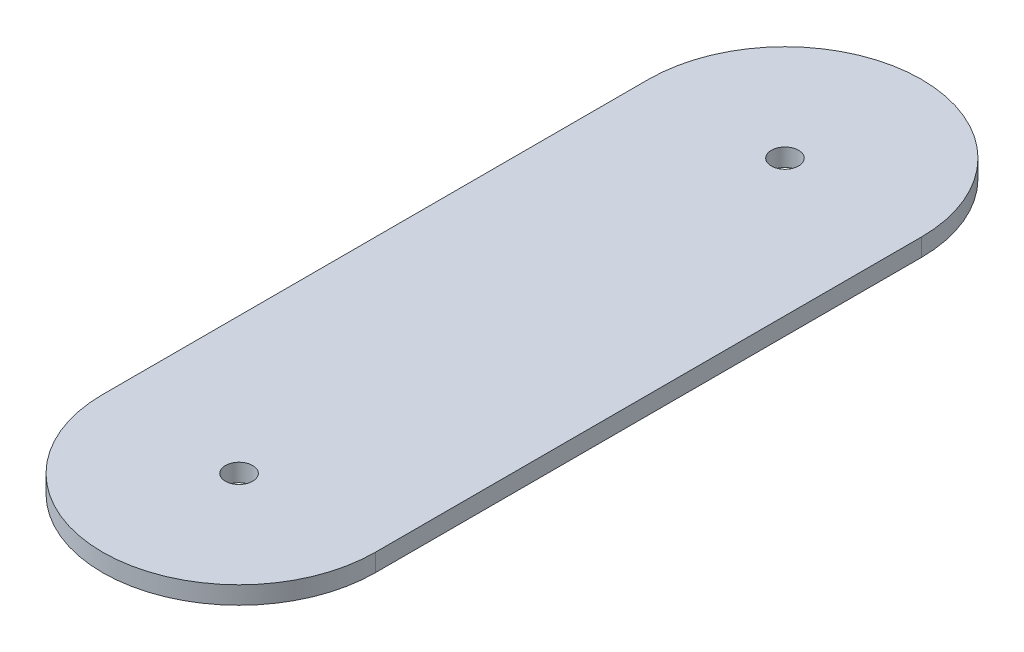
ISO-10303-21;
HEADER;
FILE_DESCRIPTION(('STEP AP214'),'2;1');
FILE_NAME('part.step','',(''),(''),'','','');
FILE_SCHEMA(('AUTOMOTIVE_DESIGN { 1 0 10303 214 1 1 1 1 }'));
ENDSEC;
DATA;
#1=APPLICATION_CONTEXT('core data for automotive mechanical design processes');
#2=APPLICATION_PROTOCOL_DEFINITION('international standard','automotive_design',2000,#1);
#3=PRODUCT_CONTEXT('',#1,'mechanical');
#4=PRODUCT('Part','Part','',(#3));
#5=PRODUCT_RELATED_PRODUCT_CATEGORY('part','',(#4));
#6=PRODUCT_DEFINITION_FORMATION('','',#4);
#7=PRODUCT_DEFINITION_CONTEXT('part definition',#1,'design');
#8=PRODUCT_DEFINITION('design','',#6,#7);
#9=PRODUCT_DEFINITION_SHAPE('','',#8);
#10=(LENGTH_UNIT() NAMED_UNIT(*) SI_UNIT(.MILLI.,.METRE.));
#11=(NAMED_UNIT(*) PLANE_ANGLE_UNIT() SI_UNIT($,.RADIAN.));
#12=(NAMED_UNIT(*) SI_UNIT($,.STERADIAN.) SOLID_ANGLE_UNIT());
#13=UNCERTAINTY_MEASURE_WITH_UNIT(LENGTH_MEASURE(1.E-05),#10,'distance_accuracy_value','');
#14=(GEOMETRIC_REPRESENTATION_CONTEXT(3) GLOBAL_UNCERTAINTY_ASSIGNED_CONTEXT((#13)) GLOBAL_UNIT_ASSIGNED_CONTEXT((#10,
#11,#12)) REPRESENTATION_CONTEXT('',''));
#15=CARTESIAN_POINT('',(0.,0.,0.));
#16=DIRECTION('',(0.,0.,1.));
#17=DIRECTION('',(1.,0.,0.));
#18=AXIS2_PLACEMENT_3D('',#15,#16,#17);
#19=CARTESIAN_POINT('',(25.4,3.302,0.));
#20=DIRECTION('',(0.,-1.,0.));
#21=DIRECTION('',(0.,0.,-1.));
#22=AXIS2_PLACEMENT_3D('',#19,#20,#21);
#23=PLANE('',#22);
#24=CARTESIAN_POINT('',(25.4,3.302,0.));
#25=DIRECTION('',(0.,1.,0.));
#26=DIRECTION('',(0.,0.,-1.));
#27=AXIS2_PLACEMENT_3D('',#24,#25,#26);
#28=CIRCLE('',#27,25.4);
#29=CARTESIAN_POINT('',(50.8,3.302,0.));
#30=VERTEX_POINT('',#29);
#31=CARTESIAN_POINT('',(0.,3.302,0.));
#32=VERTEX_POINT('',#31);
#33=EDGE_CURVE('E92',#30,#32,#28,.T.);
#34=ORIENTED_EDGE('',*,*,#33,.T.);
#35=DIRECTION('',(0.,0.,1.));
#36=VECTOR('',#35,1.);
#37=CARTESIAN_POINT('',(0.,3.302,0.));
#38=LINE('',#37,#36);
#39=CARTESIAN_POINT('',(0.,3.302,101.6));
#40=VERTEX_POINT('',#39);
#41=EDGE_CURVE('E87',#32,#40,#38,.T.);
#42=ORIENTED_EDGE('',*,*,#41,.T.);
#43=CARTESIAN_POINT('',(25.4,3.302,101.6));
#44=DIRECTION('',(0.,1.,0.));
#45=DIRECTION('',(0.,0.,1.));
#46=AXIS2_PLACEMENT_3D('',#43,#44,#45);
#47=CIRCLE('',#46,25.4);
#48=CARTESIAN_POINT('',(50.8,3.302,101.6));
#49=VERTEX_POINT('',#48);
#50=EDGE_CURVE('E90',#40,#49,#47,.T.);
#51=ORIENTED_EDGE('',*,*,#50,.T.);
#52=DIRECTION('',(0.,0.,-1.));
#53=VECTOR('',#52,1.);
#54=CARTESIAN_POINT('',(50.8,3.302,0.));
#55=LINE('',#54,#53);
#56=EDGE_CURVE('E57',#49,#30,#55,.T.);
#57=ORIENTED_EDGE('',*,*,#56,.T.);
#58=EDGE_LOOP('',(#34,#42,#51,#57));
#59=FACE_BOUND('',#58,.T.);
#60=CARTESIAN_POINT('',(25.4,3.302,0.));
#61=DIRECTION('',(0.,1.,0.));
#62=DIRECTION('',(0.,0.,1.));
#63=AXIS2_PLACEMENT_3D('',#60,#61,#62);
#64=CIRCLE('',#63,2.54);
#65=CARTESIAN_POINT('',(25.4,3.302,-2.53999999999999));
#66=VERTEX_POINT('',#65);
#67=EDGE_CURVE('E112',#66,#66,#64,.T.);
#68=ORIENTED_EDGE('',*,*,#67,.F.);
#69=EDGE_LOOP('',(#68));
#70=FACE_BOUND('',#69,.T.);
#71=CARTESIAN_POINT('',(25.4,3.302,101.6));
#72=DIRECTION('',(0.,1.,0.));
#73=DIRECTION('',(0.,0.,1.));
#74=AXIS2_PLACEMENT_3D('',#71,#72,#73);
#75=CIRCLE('',#74,2.54);
#76=CARTESIAN_POINT('',(25.4,3.302,99.06));
#77=VERTEX_POINT('',#76);
#78=EDGE_CURVE('E134',#77,#77,#75,.T.);
#79=ORIENTED_EDGE('',*,*,#78,.F.);
#80=EDGE_LOOP('',(#79));
#81=FACE_BOUND('',#80,.T.);
#82=ADVANCED_FACE('F39',(#59,#70,#81),#23,.F.);
#83=CARTESIAN_POINT('',(25.4,0.,0.));
#84=DIRECTION('',(0.,-1.,0.));
#85=DIRECTION('',(0.,0.,-1.));
#86=AXIS2_PLACEMENT_3D('',#83,#84,#85);
#87=PLANE('',#86);
#88=CARTESIAN_POINT('',(25.4,0.,0.));
#89=DIRECTION('',(0.,1.,0.));
#90=DIRECTION('',(0.,0.,1.));
#91=AXIS2_PLACEMENT_3D('',#88,#89,#90);
#92=CIRCLE('',#91,2.54);
#93=CARTESIAN_POINT('',(25.4,0.,-2.53999999999999));
#94=VERTEX_POINT('',#93);
#95=EDGE_CURVE('E130',#94,#94,#92,.T.);
#96=ORIENTED_EDGE('',*,*,#95,.T.);
#97=EDGE_LOOP('',(#96));
#98=FACE_BOUND('',#97,.T.);
#99=CARTESIAN_POINT('',(25.4,0.,0.));
#100=DIRECTION('',(0.,1.,0.));
#101=DIRECTION('',(0.,0.,-1.));
#102=AXIS2_PLACEMENT_3D('',#99,#100,#101);
#103=CIRCLE('',#102,25.4);
#104=CARTESIAN_POINT('',(50.8,0.,0.));
#105=VERTEX_POINT('',#104);
#106=CARTESIAN_POINT('',(0.,0.,0.));
#107=VERTEX_POINT('',#106);
#108=EDGE_CURVE('E108',#105,#107,#103,.T.);
#109=ORIENTED_EDGE('',*,*,#108,.F.);
#110=DIRECTION('',(0.,0.,-1.));
#111=VECTOR('',#110,1.);
#112=CARTESIAN_POINT('',(50.8,0.,0.));
#113=LINE('',#112,#111);
#114=CARTESIAN_POINT('',(50.8,0.,101.6));
#115=VERTEX_POINT('',#114);
#116=EDGE_CURVE('E80',#115,#105,#113,.T.);
#117=ORIENTED_EDGE('',*,*,#116,.F.);
#118=CARTESIAN_POINT('',(25.4,0.,101.6));
#119=DIRECTION('',(0.,1.,0.));
#120=DIRECTION('',(0.,0.,1.));
#121=AXIS2_PLACEMENT_3D('',#118,#119,#120);
#122=CIRCLE('',#121,25.4);
#123=CARTESIAN_POINT('',(0.,0.,101.6));
#124=VERTEX_POINT('',#123);
#125=EDGE_CURVE('E74',#124,#115,#122,.T.);
#126=ORIENTED_EDGE('',*,*,#125,.F.);
#127=DIRECTION('',(0.,0.,1.));
#128=VECTOR('',#127,1.);
#129=CARTESIAN_POINT('',(0.,0.,0.));
#130=LINE('',#129,#128);
#131=EDGE_CURVE('E97',#107,#124,#130,.T.);
#132=ORIENTED_EDGE('',*,*,#131,.F.);
#133=EDGE_LOOP('',(#109,#117,#126,#132));
#134=FACE_BOUND('',#133,.T.);
#135=CARTESIAN_POINT('',(25.4,0.,101.6));
#136=DIRECTION('',(0.,1.,0.));
#137=DIRECTION('',(0.,0.,1.));
#138=AXIS2_PLACEMENT_3D('',#135,#136,#137);
#139=CIRCLE('',#138,2.54);
#140=CARTESIAN_POINT('',(25.4,0.,99.06));
#141=VERTEX_POINT('',#140);
#142=EDGE_CURVE('E138',#141,#141,#139,.T.);
#143=ORIENTED_EDGE('',*,*,#142,.T.);
#144=EDGE_LOOP('',(#143));
#145=FACE_BOUND('',#144,.T.);
#146=ADVANCED_FACE('F125',(#98,#134,#145),#87,.T.);
#147=CARTESIAN_POINT('',(25.4,3.302,0.));
#148=DIRECTION('',(0.,-1.,0.));
#149=DIRECTION('',(0.,0.,-1.));
#150=AXIS2_PLACEMENT_3D('',#147,#148,#149);
#151=CYLINDRICAL_SURFACE('',#150,25.4);
#152=ORIENTED_EDGE('',*,*,#108,.T.);
#153=DIRECTION('',(0.,-1.,0.));
#154=VECTOR('',#153,1.);
#155=CARTESIAN_POINT('',(0.,3.302,0.));
#156=LINE('',#155,#154);
#157=EDGE_CURVE('E11',#32,#107,#156,.T.);
#158=ORIENTED_EDGE('',*,*,#157,.F.);
#159=ORIENTED_EDGE('',*,*,#33,.F.);
#160=DIRECTION('',(0.,-1.,0.));
#161=VECTOR('',#160,1.);
#162=CARTESIAN_POINT('',(50.8,3.302,0.));
#163=LINE('',#162,#161);
#164=EDGE_CURVE('E104',#30,#105,#163,.T.);
#165=ORIENTED_EDGE('',*,*,#164,.T.);
#166=EDGE_LOOP('',(#152,#158,#159,#165));
#167=FACE_BOUND('',#166,.T.);
#168=ADVANCED_FACE('F41',(#167),#151,.T.);
#169=CARTESIAN_POINT('',(0.,3.302,0.));
#170=DIRECTION('',(1.,0.,0.));
#171=DIRECTION('',(0.,0.,-1.));
#172=AXIS2_PLACEMENT_3D('',#169,#170,#171);
#173=PLANE('',#172);
#174=ORIENTED_EDGE('',*,*,#131,.T.);
#175=DIRECTION('',(0.,-1.,0.));
#176=VECTOR('',#175,1.);
#177=CARTESIAN_POINT('',(0.,3.302,101.6));
#178=LINE('',#177,#176);
#179=EDGE_CURVE('E49',#40,#124,#178,.T.);
#180=ORIENTED_EDGE('',*,*,#179,.F.);
#181=ORIENTED_EDGE('',*,*,#41,.F.);
#182=ORIENTED_EDGE('',*,*,#157,.T.);
#183=EDGE_LOOP('',(#174,#180,#181,#182));
#184=FACE_BOUND('',#183,.T.);
#185=ADVANCED_FACE('F96',(#184),#173,.F.);
#186=CARTESIAN_POINT('',(25.4,3.302,101.6));
#187=DIRECTION('',(0.,-1.,0.));
#188=DIRECTION('',(0.,0.,-1.));
#189=AXIS2_PLACEMENT_3D('',#186,#187,#188);
#190=CYLINDRICAL_SURFACE('',#189,25.4);
#191=ORIENTED_EDGE('',*,*,#125,.T.);
#192=DIRECTION('',(0.,-1.,0.));
#193=VECTOR('',#192,1.);
#194=CARTESIAN_POINT('',(50.8,3.302,101.6));
#195=LINE('',#194,#193);
#196=EDGE_CURVE('E99',#49,#115,#195,.T.);
#197=ORIENTED_EDGE('',*,*,#196,.F.);
#198=ORIENTED_EDGE('',*,*,#50,.F.);
#199=ORIENTED_EDGE('',*,*,#179,.T.);
#200=EDGE_LOOP('',(#191,#197,#198,#199));
#201=FACE_BOUND('',#200,.T.);
#202=ADVANCED_FACE('F100',(#201),#190,.T.);
#203=CARTESIAN_POINT('',(50.8,3.302,0.));
#204=DIRECTION('',(-1.,0.,0.));
#205=DIRECTION('',(0.,0.,1.));
#206=AXIS2_PLACEMENT_3D('',#203,#204,#205);
#207=PLANE('',#206);
#208=ORIENTED_EDGE('',*,*,#116,.T.);
#209=ORIENTED_EDGE('',*,*,#164,.F.);
#210=ORIENTED_EDGE('',*,*,#56,.F.);
#211=ORIENTED_EDGE('',*,*,#196,.T.);
#212=EDGE_LOOP('',(#208,#209,#210,#211));
#213=FACE_BOUND('',#212,.T.);
#214=ADVANCED_FACE('F122',(#213),#207,.F.);
#215=CARTESIAN_POINT('',(25.4,3.302,0.));
#216=DIRECTION('',(0.,-1.,0.));
#217=DIRECTION('',(0.,0.,-1.));
#218=AXIS2_PLACEMENT_3D('',#215,#216,#217);
#219=CYLINDRICAL_SURFACE('',#218,2.54);
#220=CARTESIAN_POINT('',(25.4,3.302,-2.53999999999999));
#221=CARTESIAN_POINT('',(25.4,3.26760416666667,-2.53999999999999));
#222=CARTESIAN_POINT('',(25.4,3.23320833333333,-2.53999999999999));
#223=CARTESIAN_POINT('',(25.4,3.16441666666667,-2.53999999999999));
#224=CARTESIAN_POINT('',(25.4,3.13002083333333,-2.53999999999999));
#225=CARTESIAN_POINT('',(25.4,3.06122916666667,-2.53999999999999));
#226=CARTESIAN_POINT('',(25.4,3.02683333333333,-2.53999999999999));
#227=CARTESIAN_POINT('',(25.4,2.95804166666667,-2.53999999999999));
#228=CARTESIAN_POINT('',(25.4,2.92364583333333,-2.53999999999999));
#229=CARTESIAN_POINT('',(25.4,2.85485416666667,-2.53999999999999));
#230=CARTESIAN_POINT('',(25.4,2.82045833333333,-2.53999999999999));
#231=CARTESIAN_POINT('',(25.4,2.75166666666667,-2.53999999999999));
#232=CARTESIAN_POINT('',(25.4,2.71727083333333,-2.53999999999999));
#233=CARTESIAN_POINT('',(25.4,2.64847916666667,-2.53999999999999));
#234=CARTESIAN_POINT('',(25.4,2.61408333333333,-2.53999999999999));
#235=CARTESIAN_POINT('',(25.4,2.54529166666667,-2.53999999999999));
#236=CARTESIAN_POINT('',(25.4,2.51089583333333,-2.53999999999999));
#237=CARTESIAN_POINT('',(25.4,2.44210416666667,-2.53999999999999));
#238=CARTESIAN_POINT('',(25.4,2.40770833333333,-2.53999999999999));
#239=CARTESIAN_POINT('',(25.4,2.33891666666667,-2.53999999999999));
#240=CARTESIAN_POINT('',(25.4,2.30452083333333,-2.53999999999999));
#241=CARTESIAN_POINT('',(25.4,2.23572916666667,-2.53999999999999));
#242=CARTESIAN_POINT('',(25.4,2.20133333333333,-2.53999999999999));
#243=CARTESIAN_POINT('',(25.4,2.13254166666667,-2.53999999999999));
#244=CARTESIAN_POINT('',(25.4,2.09814583333333,-2.53999999999999));
#245=CARTESIAN_POINT('',(25.4,2.02935416666667,-2.53999999999999));
#246=CARTESIAN_POINT('',(25.4,1.99495833333333,-2.53999999999999));
#247=CARTESIAN_POINT('',(25.4,1.92616666666667,-2.53999999999999));
#248=CARTESIAN_POINT('',(25.4,1.89177083333333,-2.53999999999999));
#249=CARTESIAN_POINT('',(25.4,1.82297916666667,-2.53999999999999));
#250=CARTESIAN_POINT('',(25.4,1.78858333333333,-2.53999999999999));
#251=CARTESIAN_POINT('',(25.4,1.71979166666667,-2.53999999999999));
#252=CARTESIAN_POINT('',(25.4,1.68539583333333,-2.53999999999999));
#253=CARTESIAN_POINT('',(25.4,1.61660416666667,-2.53999999999999));
#254=CARTESIAN_POINT('',(25.4,1.58220833333333,-2.53999999999999));
#255=CARTESIAN_POINT('',(25.4,1.51341666666667,-2.53999999999999));
#256=CARTESIAN_POINT('',(25.4,1.47902083333333,-2.53999999999999));
#257=CARTESIAN_POINT('',(25.4,1.41022916666667,-2.53999999999999));
#258=CARTESIAN_POINT('',(25.4,1.37583333333333,-2.53999999999999));
#259=CARTESIAN_POINT('',(25.4,1.30704166666667,-2.53999999999999));
#260=CARTESIAN_POINT('',(25.4,1.27264583333333,-2.53999999999999));
#261=CARTESIAN_POINT('',(25.4,1.20385416666667,-2.53999999999999));
#262=CARTESIAN_POINT('',(25.4,1.16945833333333,-2.53999999999999));
#263=CARTESIAN_POINT('',(25.4,1.10066666666667,-2.53999999999999));
#264=CARTESIAN_POINT('',(25.4,1.06627083333333,-2.53999999999999));
#265=CARTESIAN_POINT('',(25.4,0.997479166666667,-2.53999999999999));
#266=CARTESIAN_POINT('',(25.4,0.963083333333334,-2.53999999999999));
#267=CARTESIAN_POINT('',(25.4,0.894291666666667,-2.53999999999999));
#268=CARTESIAN_POINT('',(25.4,0.859895833333333,-2.53999999999999));
#269=CARTESIAN_POINT('',(25.4,0.791104166666666,-2.53999999999999));
#270=CARTESIAN_POINT('',(25.4,0.756708333333333,-2.53999999999999));
#271=CARTESIAN_POINT('',(25.4,0.687916666666667,-2.53999999999999));
#272=CARTESIAN_POINT('',(25.4,0.653520833333333,-2.53999999999999));
#273=CARTESIAN_POINT('',(25.4,0.584729166666667,-2.53999999999999));
#274=CARTESIAN_POINT('',(25.4,0.550333333333333,-2.53999999999999));
#275=CARTESIAN_POINT('',(25.4,0.481541666666667,-2.53999999999999));
#276=CARTESIAN_POINT('',(25.4,0.447145833333333,-2.53999999999999));
#277=CARTESIAN_POINT('',(25.4,0.378354166666667,-2.53999999999999));
#278=CARTESIAN_POINT('',(25.4,0.343958333333333,-2.53999999999999));
#279=CARTESIAN_POINT('',(25.4,0.275166666666667,-2.53999999999999));
#280=CARTESIAN_POINT('',(25.4,0.240770833333333,-2.53999999999999));
#281=CARTESIAN_POINT('',(25.4,0.171979166666667,-2.53999999999999));
#282=CARTESIAN_POINT('',(25.4,0.137583333333333,-2.53999999999999));
#283=CARTESIAN_POINT('',(25.4,0.0687916666666666,-2.53999999999999));
#284=CARTESIAN_POINT('',(25.4,0.0343958333333333,-2.53999999999999));
#285=CARTESIAN_POINT('',(25.4,0.,-2.53999999999999));
#286=B_SPLINE_CURVE_WITH_KNOTS('',3,(#220,#221,#222,#223,#224,#225,#226,#227,#228,#229,#230,
#231,#232,#233,#234,#235,#236,#237,#238,#239,#240,#241,#242,#243,#244,#245,#246,#247,#248,#249,
#250,#251,#252,#253,#254,#255,#256,#257,#258,#259,#260,#261,#262,#263,#264,#265,#266,#267,#268,
#269,#270,#271,#272,#273,#274,#275,#276,#277,#278,#279,#280,#281,#282,#283,#284,#285),
.UNSPECIFIED.,.F.,.F.,(4,2,2,2,2,2,2,2,2,2,2,2,2,2,2,2,2,2,2,2,2,2,2,2,2,2,2,2,2,2,2,2,4),(0.,
0.1031875,0.206375,0.3095625,0.41275,0.5159375,0.619125,0.7223125,0.8255,0.9286875,1.031875,
1.1350625,1.23825,1.3414375,1.444625,1.5478125,1.651,1.7541875,1.857375,1.9605625,2.06375,
2.1669375,2.270125,2.3733125,2.4765,2.5796875,2.682875,2.7860625,2.88925,2.9924375,3.095625,
3.1988125,3.302),.UNSPECIFIED.);
#287=EDGE_CURVE('BSEAM157',#66,#94,#286,.T.);
#288=ORIENTED_EDGE('',*,*,#67,.T.);
#289=ORIENTED_EDGE('',*,*,#95,.F.);
#290=ORIENTED_EDGE('',*,*,#287,.T.);
#291=ORIENTED_EDGE('',*,*,#287,.F.);
#292=EDGE_LOOP('',(#288,#290,#289,#291));
#293=FACE_BOUND('',#292,.T.);
#294=ADVANCED_FACE('F157',(#293),#219,.F.);
#295=CARTESIAN_POINT('',(25.4,3.302,101.6));
#296=DIRECTION('',(0.,-1.,0.));
#297=DIRECTION('',(0.,0.,-1.));
#298=AXIS2_PLACEMENT_3D('',#295,#296,#297);
#299=CYLINDRICAL_SURFACE('',#298,2.54);
#300=CARTESIAN_POINT('',(25.4,3.302,99.06));
#301=CARTESIAN_POINT('',(25.4,3.26760416666667,99.06));
#302=CARTESIAN_POINT('',(25.4,3.23320833333333,99.06));
#303=CARTESIAN_POINT('',(25.4,3.16441666666667,99.06));
#304=CARTESIAN_POINT('',(25.4,3.13002083333333,99.06));
#305=CARTESIAN_POINT('',(25.4,3.06122916666667,99.06));
#306=CARTESIAN_POINT('',(25.4,3.02683333333333,99.06));
#307=CARTESIAN_POINT('',(25.4,2.95804166666667,99.06));
#308=CARTESIAN_POINT('',(25.4,2.92364583333333,99.06));
#309=CARTESIAN_POINT('',(25.4,2.85485416666667,99.06));
#310=CARTESIAN_POINT('',(25.4,2.82045833333333,99.06));
#311=CARTESIAN_POINT('',(25.4,2.75166666666667,99.06));
#312=CARTESIAN_POINT('',(25.4,2.71727083333333,99.06));
#313=CARTESIAN_POINT('',(25.4,2.64847916666667,99.06));
#314=CARTESIAN_POINT('',(25.4,2.61408333333333,99.06));
#315=CARTESIAN_POINT('',(25.4,2.54529166666667,99.06));
#316=CARTESIAN_POINT('',(25.4,2.51089583333333,99.06));
#317=CARTESIAN_POINT('',(25.4,2.44210416666667,99.06));
#318=CARTESIAN_POINT('',(25.4,2.40770833333333,99.06));
#319=CARTESIAN_POINT('',(25.4,2.33891666666667,99.06));
#320=CARTESIAN_POINT('',(25.4,2.30452083333333,99.06));
#321=CARTESIAN_POINT('',(25.4,2.23572916666667,99.06));
#322=CARTESIAN_POINT('',(25.4,2.20133333333333,99.06));
#323=CARTESIAN_POINT('',(25.4,2.13254166666667,99.06));
#324=CARTESIAN_POINT('',(25.4,2.09814583333333,99.06));
#325=CARTESIAN_POINT('',(25.4,2.02935416666667,99.06));
#326=CARTESIAN_POINT('',(25.4,1.99495833333333,99.06));
#327=CARTESIAN_POINT('',(25.4,1.92616666666667,99.06));
#328=CARTESIAN_POINT('',(25.4,1.89177083333333,99.06));
#329=CARTESIAN_POINT('',(25.4,1.82297916666667,99.06));
#330=CARTESIAN_POINT('',(25.4,1.78858333333333,99.06));
#331=CARTESIAN_POINT('',(25.4,1.71979166666667,99.06));
#332=CARTESIAN_POINT('',(25.4,1.68539583333333,99.06));
#333=CARTESIAN_POINT('',(25.4,1.61660416666667,99.06));
#334=CARTESIAN_POINT('',(25.4,1.58220833333333,99.06));
#335=CARTESIAN_POINT('',(25.4,1.51341666666667,99.06));
#336=CARTESIAN_POINT('',(25.4,1.47902083333333,99.06));
#337=CARTESIAN_POINT('',(25.4,1.41022916666667,99.06));
#338=CARTESIAN_POINT('',(25.4,1.37583333333333,99.06));
#339=CARTESIAN_POINT('',(25.4,1.30704166666667,99.06));
#340=CARTESIAN_POINT('',(25.4,1.27264583333333,99.06));
#341=CARTESIAN_POINT('',(25.4,1.20385416666667,99.06));
#342=CARTESIAN_POINT('',(25.4,1.16945833333333,99.06));
#343=CARTESIAN_POINT('',(25.4,1.10066666666667,99.06));
#344=CARTESIAN_POINT('',(25.4,1.06627083333333,99.06));
#345=CARTESIAN_POINT('',(25.4,0.997479166666667,99.06));
#346=CARTESIAN_POINT('',(25.4,0.963083333333334,99.06));
#347=CARTESIAN_POINT('',(25.4,0.894291666666667,99.06));
#348=CARTESIAN_POINT('',(25.4,0.859895833333333,99.06));
#349=CARTESIAN_POINT('',(25.4,0.791104166666666,99.06));
#350=CARTESIAN_POINT('',(25.4,0.756708333333333,99.06));
#351=CARTESIAN_POINT('',(25.4,0.687916666666667,99.06));
#352=CARTESIAN_POINT('',(25.4,0.653520833333333,99.06));
#353=CARTESIAN_POINT('',(25.4,0.584729166666667,99.06));
#354=CARTESIAN_POINT('',(25.4,0.550333333333333,99.06));
#355=CARTESIAN_POINT('',(25.4,0.481541666666667,99.06));
#356=CARTESIAN_POINT('',(25.4,0.447145833333333,99.06));
#357=CARTESIAN_POINT('',(25.4,0.378354166666667,99.06));
#358=CARTESIAN_POINT('',(25.4,0.343958333333333,99.06));
#359=CARTESIAN_POINT('',(25.4,0.275166666666667,99.06));
#360=CARTESIAN_POINT('',(25.4,0.240770833333333,99.06));
#361=CARTESIAN_POINT('',(25.4,0.171979166666667,99.06));
#362=CARTESIAN_POINT('',(25.4,0.137583333333333,99.06));
#363=CARTESIAN_POINT('',(25.4,0.0687916666666666,99.06));
#364=CARTESIAN_POINT('',(25.4,0.0343958333333333,99.06));
#365=CARTESIAN_POINT('',(25.4,0.,99.06));
#366=B_SPLINE_CURVE_WITH_KNOTS('',3,(#300,#301,#302,#303,#304,#305,#306,#307,#308,#309,#310,
#311,#312,#313,#314,#315,#316,#317,#318,#319,#320,#321,#322,#323,#324,#325,#326,#327,#328,#329,
#330,#331,#332,#333,#334,#335,#336,#337,#338,#339,#340,#341,#342,#343,#344,#345,#346,#347,#348,
#349,#350,#351,#352,#353,#354,#355,#356,#357,#358,#359,#360,#361,#362,#363,#364,#365),
.UNSPECIFIED.,.F.,.F.,(4,2,2,2,2,2,2,2,2,2,2,2,2,2,2,2,2,2,2,2,2,2,2,2,2,2,2,2,2,2,2,2,4),(0.,
0.1031875,0.206375,0.3095625,0.41275,0.5159375,0.619125,0.7223125,0.8255,0.9286875,1.031875,
1.1350625,1.23825,1.3414375,1.444625,1.5478125,1.651,1.7541875,1.857375,1.9605625,2.06375,
2.1669375,2.270125,2.3733125,2.4765,2.5796875,2.682875,2.7860625,2.88925,2.9924375,3.095625,
3.1988125,3.302),.UNSPECIFIED.);
#367=EDGE_CURVE('BSEAM146',#77,#141,#366,.T.);
#368=ORIENTED_EDGE('',*,*,#78,.T.);
#369=ORIENTED_EDGE('',*,*,#142,.F.);
#370=ORIENTED_EDGE('',*,*,#367,.T.);
#371=ORIENTED_EDGE('',*,*,#367,.F.);
#372=EDGE_LOOP('',(#368,#370,#369,#371));
#373=FACE_BOUND('',#372,.T.);
#374=ADVANCED_FACE('F146',(#373),#299,.F.);
#375=CLOSED_SHELL('',(#82,#146,#168,#185,#202,#214,#294,#374));
#376=MANIFOLD_SOLID_BREP('B2',#375);
#377=ADVANCED_BREP_SHAPE_REPRESENTATION('',(#18,#376),#14);
#378=SHAPE_DEFINITION_REPRESENTATION(#9,#377);
ENDSEC;
END-ISO-10303-21;
